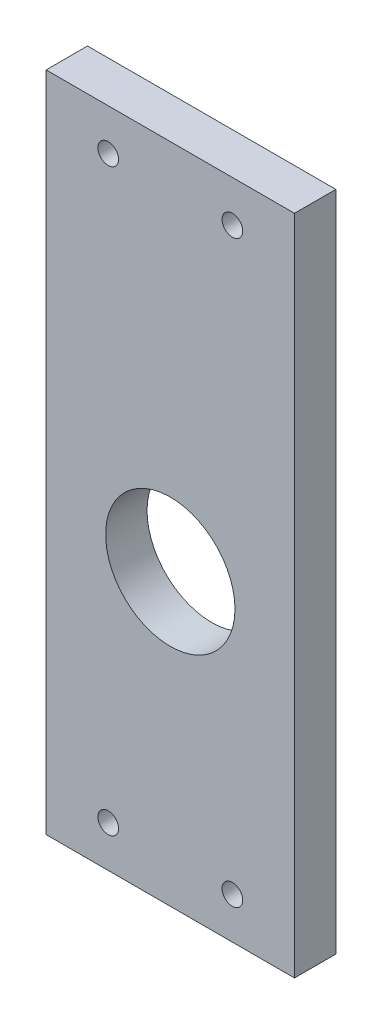
ISO-10303-21;
HEADER;
FILE_DESCRIPTION(('STEP AP214'),'2;1');
FILE_NAME('part.step','',(''),(''),'','','');
FILE_SCHEMA(('AUTOMOTIVE_DESIGN { 1 0 10303 214 1 1 1 1 }'));
ENDSEC;
DATA;
#1=APPLICATION_CONTEXT('core data for automotive mechanical design processes');
#2=APPLICATION_PROTOCOL_DEFINITION('international standard','automotive_design',2000,#1);
#3=PRODUCT_CONTEXT('',#1,'mechanical');
#4=PRODUCT('Part','Part','',(#3));
#5=PRODUCT_RELATED_PRODUCT_CATEGORY('part','',(#4));
#6=PRODUCT_DEFINITION_FORMATION('','',#4);
#7=PRODUCT_DEFINITION_CONTEXT('part definition',#1,'design');
#8=PRODUCT_DEFINITION('design','',#6,#7);
#9=PRODUCT_DEFINITION_SHAPE('','',#8);
#10=(LENGTH_UNIT() NAMED_UNIT(*) SI_UNIT(.MILLI.,.METRE.));
#11=(NAMED_UNIT(*) PLANE_ANGLE_UNIT() SI_UNIT($,.RADIAN.));
#12=(NAMED_UNIT(*) SI_UNIT($,.STERADIAN.) SOLID_ANGLE_UNIT());
#13=UNCERTAINTY_MEASURE_WITH_UNIT(LENGTH_MEASURE(1.E-05),#10,'distance_accuracy_value','');
#14=(GEOMETRIC_REPRESENTATION_CONTEXT(3) GLOBAL_UNCERTAINTY_ASSIGNED_CONTEXT((#13)) GLOBAL_UNIT_ASSIGNED_CONTEXT((#10,
#11,#12)) REPRESENTATION_CONTEXT('',''));
#15=CARTESIAN_POINT('',(0.,0.,0.));
#16=DIRECTION('',(0.,0.,1.));
#17=DIRECTION('',(1.,0.,0.));
#18=AXIS2_PLACEMENT_3D('',#15,#16,#17);
#19=CARTESIAN_POINT('',(0.,0.,12.7));
#20=DIRECTION('',(1.,0.,0.));
#21=DIRECTION('',(0.,0.,-1.));
#22=AXIS2_PLACEMENT_3D('',#19,#20,#21);
#23=PLANE('',#22);
#24=DIRECTION('',(0.,-1.,0.));
#25=VECTOR('',#24,1.);
#26=CARTESIAN_POINT('',(0.,0.,0.));
#27=LINE('',#26,#25);
#28=CARTESIAN_POINT('',(0.,203.2,0.));
#29=VERTEX_POINT('',#28);
#30=CARTESIAN_POINT('',(0.,0.,0.));
#31=VERTEX_POINT('',#30);
#32=EDGE_CURVE('E95',#29,#31,#27,.T.);
#33=ORIENTED_EDGE('',*,*,#32,.T.);
#34=DIRECTION('',(0.,0.,-1.));
#35=VECTOR('',#34,1.);
#36=CARTESIAN_POINT('',(0.,0.,12.7));
#37=LINE('',#36,#35);
#38=CARTESIAN_POINT('',(0.,0.,12.7));
#39=VERTEX_POINT('',#38);
#40=EDGE_CURVE('E11',#39,#31,#37,.T.);
#41=ORIENTED_EDGE('',*,*,#40,.F.);
#42=DIRECTION('',(0.,-1.,0.));
#43=VECTOR('',#42,1.);
#44=CARTESIAN_POINT('',(0.,0.,12.7));
#45=LINE('',#44,#43);
#46=CARTESIAN_POINT('',(0.,203.2,12.7));
#47=VERTEX_POINT('',#46);
#48=EDGE_CURVE('E83',#47,#39,#45,.T.);
#49=ORIENTED_EDGE('',*,*,#48,.F.);
#50=DIRECTION('',(0.,0.,-1.));
#51=VECTOR('',#50,1.);
#52=CARTESIAN_POINT('',(0.,203.2,12.7));
#53=LINE('',#52,#51);
#54=EDGE_CURVE('E91',#47,#29,#53,.T.);
#55=ORIENTED_EDGE('',*,*,#54,.T.);
#56=EDGE_LOOP('',(#33,#41,#49,#55));
#57=FACE_BOUND('',#56,.T.);
#58=ADVANCED_FACE('F32',(#57),#23,.F.);
#59=CARTESIAN_POINT('',(0.,0.,12.7));
#60=DIRECTION('',(0.,1.,0.));
#61=DIRECTION('',(0.,0.,1.));
#62=AXIS2_PLACEMENT_3D('',#59,#60,#61);
#63=PLANE('',#62);
#64=DIRECTION('',(1.,0.,0.));
#65=VECTOR('',#64,1.);
#66=CARTESIAN_POINT('',(0.,0.,0.));
#67=LINE('',#66,#65);
#68=CARTESIAN_POINT('',(76.2,0.,0.));
#69=VERTEX_POINT('',#68);
#70=EDGE_CURVE('E87',#31,#69,#67,.T.);
#71=ORIENTED_EDGE('',*,*,#70,.T.);
#72=DIRECTION('',(0.,0.,-1.));
#73=VECTOR('',#72,1.);
#74=CARTESIAN_POINT('',(76.2,0.,12.7));
#75=LINE('',#74,#73);
#76=CARTESIAN_POINT('',(76.2,0.,12.7));
#77=VERTEX_POINT('',#76);
#78=EDGE_CURVE('E40',#77,#69,#75,.T.);
#79=ORIENTED_EDGE('',*,*,#78,.F.);
#80=DIRECTION('',(1.,0.,0.));
#81=VECTOR('',#80,1.);
#82=CARTESIAN_POINT('',(0.,0.,12.7));
#83=LINE('',#82,#81);
#84=EDGE_CURVE('E78',#39,#77,#83,.T.);
#85=ORIENTED_EDGE('',*,*,#84,.F.);
#86=ORIENTED_EDGE('',*,*,#40,.T.);
#87=EDGE_LOOP('',(#71,#79,#85,#86));
#88=FACE_BOUND('',#87,.T.);
#89=ADVANCED_FACE('F86',(#88),#63,.F.);
#90=CARTESIAN_POINT('',(76.2,0.,12.7));
#91=DIRECTION('',(-1.,0.,0.));
#92=DIRECTION('',(0.,0.,1.));
#93=AXIS2_PLACEMENT_3D('',#90,#91,#92);
#94=PLANE('',#93);
#95=DIRECTION('',(0.,1.,0.));
#96=VECTOR('',#95,1.);
#97=CARTESIAN_POINT('',(76.2,0.,0.));
#98=LINE('',#97,#96);
#99=CARTESIAN_POINT('',(76.2,203.2,0.));
#100=VERTEX_POINT('',#99);
#101=EDGE_CURVE('E65',#69,#100,#98,.T.);
#102=ORIENTED_EDGE('',*,*,#101,.T.);
#103=DIRECTION('',(0.,0.,-1.));
#104=VECTOR('',#103,1.);
#105=CARTESIAN_POINT('',(76.2,203.2,12.7));
#106=LINE('',#105,#104);
#107=CARTESIAN_POINT('',(76.2,203.2,12.7));
#108=VERTEX_POINT('',#107);
#109=EDGE_CURVE('E88',#108,#100,#106,.T.);
#110=ORIENTED_EDGE('',*,*,#109,.F.);
#111=DIRECTION('',(0.,1.,0.));
#112=VECTOR('',#111,1.);
#113=CARTESIAN_POINT('',(76.2,0.,12.7));
#114=LINE('',#113,#112);
#115=EDGE_CURVE('E81',#77,#108,#114,.T.);
#116=ORIENTED_EDGE('',*,*,#115,.F.);
#117=ORIENTED_EDGE('',*,*,#78,.T.);
#118=EDGE_LOOP('',(#102,#110,#116,#117));
#119=FACE_BOUND('',#118,.T.);
#120=ADVANCED_FACE('F89',(#119),#94,.F.);
#121=CARTESIAN_POINT('',(0.,203.2,12.7));
#122=DIRECTION('',(0.,-1.,0.));
#123=DIRECTION('',(0.,0.,-1.));
#124=AXIS2_PLACEMENT_3D('',#121,#122,#123);
#125=PLANE('',#124);
#126=DIRECTION('',(-1.,0.,0.));
#127=VECTOR('',#126,1.);
#128=CARTESIAN_POINT('',(0.,203.2,0.));
#129=LINE('',#128,#127);
#130=EDGE_CURVE('E71',#100,#29,#129,.T.);
#131=ORIENTED_EDGE('',*,*,#130,.T.);
#132=ORIENTED_EDGE('',*,*,#54,.F.);
#133=DIRECTION('',(-1.,0.,0.));
#134=VECTOR('',#133,1.);
#135=CARTESIAN_POINT('',(0.,203.2,12.7));
#136=LINE('',#135,#134);
#137=EDGE_CURVE('E48',#108,#47,#136,.T.);
#138=ORIENTED_EDGE('',*,*,#137,.F.);
#139=ORIENTED_EDGE('',*,*,#109,.T.);
#140=EDGE_LOOP('',(#131,#132,#138,#139));
#141=FACE_BOUND('',#140,.T.);
#142=ADVANCED_FACE('F103',(#141),#125,.F.);
#143=CARTESIAN_POINT('',(0.,0.,12.7));
#144=DIRECTION('',(0.,0.,-1.));
#145=DIRECTION('',(-1.,0.,0.));
#146=AXIS2_PLACEMENT_3D('',#143,#144,#145);
#147=PLANE('',#146);
#148=CARTESIAN_POINT('',(57.15,190.5,12.7));
#149=DIRECTION('',(0.,0.,1.));
#150=DIRECTION('',(1.,0.,0.));
#151=AXIS2_PLACEMENT_3D('',#148,#149,#150);
#152=CIRCLE('',#151,3.175);
#153=CARTESIAN_POINT('',(60.325,190.5,12.7));
#154=VERTEX_POINT('',#153);
#155=EDGE_CURVE('E124',#154,#154,#152,.T.);
#156=ORIENTED_EDGE('',*,*,#155,.F.);
#157=EDGE_LOOP('',(#156));
#158=FACE_BOUND('',#157,.T.);
#159=CARTESIAN_POINT('',(19.05,12.7,12.7));
#160=DIRECTION('',(0.,0.,1.));
#161=DIRECTION('',(1.,0.,0.));
#162=AXIS2_PLACEMENT_3D('',#159,#160,#161);
#163=CIRCLE('',#162,3.175);
#164=CARTESIAN_POINT('',(22.225,12.7,12.7));
#165=VERTEX_POINT('',#164);
#166=EDGE_CURVE('E125',#165,#165,#163,.T.);
#167=ORIENTED_EDGE('',*,*,#166,.F.);
#168=EDGE_LOOP('',(#167));
#169=FACE_BOUND('',#168,.T.);
#170=CARTESIAN_POINT('',(57.15,12.7,12.7));
#171=DIRECTION('',(0.,0.,1.));
#172=DIRECTION('',(1.,0.,0.));
#173=AXIS2_PLACEMENT_3D('',#170,#171,#172);
#174=CIRCLE('',#173,3.175);
#175=CARTESIAN_POINT('',(60.325,12.7,12.7));
#176=VERTEX_POINT('',#175);
#177=EDGE_CURVE('E135',#176,#176,#174,.T.);
#178=ORIENTED_EDGE('',*,*,#177,.F.);
#179=EDGE_LOOP('',(#178));
#180=FACE_BOUND('',#179,.T.);
#181=CARTESIAN_POINT('',(19.05,190.5,12.7));
#182=DIRECTION('',(0.,0.,1.));
#183=DIRECTION('',(1.,0.,0.));
#184=AXIS2_PLACEMENT_3D('',#181,#182,#183);
#185=CIRCLE('',#184,3.175);
#186=CARTESIAN_POINT('',(22.225,190.5,12.7));
#187=VERTEX_POINT('',#186);
#188=EDGE_CURVE('E117',#187,#187,#185,.T.);
#189=ORIENTED_EDGE('',*,*,#188,.F.);
#190=EDGE_LOOP('',(#189));
#191=FACE_BOUND('',#190,.T.);
#192=CARTESIAN_POINT('',(38.1,88.9,12.7));
#193=DIRECTION('',(0.,0.,1.));
#194=DIRECTION('',(1.,0.,0.));
#195=AXIS2_PLACEMENT_3D('',#192,#193,#194);
#196=CIRCLE('',#195,19.84375);
#197=CARTESIAN_POINT('',(57.94375,88.9,12.7));
#198=VERTEX_POINT('',#197);
#199=EDGE_CURVE('E111',#198,#198,#196,.T.);
#200=ORIENTED_EDGE('',*,*,#199,.F.);
#201=EDGE_LOOP('',(#200));
#202=FACE_BOUND('',#201,.T.);
#203=ORIENTED_EDGE('',*,*,#48,.T.);
#204=ORIENTED_EDGE('',*,*,#84,.T.);
#205=ORIENTED_EDGE('',*,*,#115,.T.);
#206=ORIENTED_EDGE('',*,*,#137,.T.);
#207=EDGE_LOOP('',(#203,#204,#205,#206));
#208=FACE_BOUND('',#207,.T.);
#209=ADVANCED_FACE('F79',(#158,#169,#180,#191,#202,#208),#147,.F.);
#210=CARTESIAN_POINT('',(0.,0.,0.));
#211=DIRECTION('',(0.,0.,-1.));
#212=DIRECTION('',(-1.,0.,0.));
#213=AXIS2_PLACEMENT_3D('',#210,#211,#212);
#214=PLANE('',#213);
#215=CARTESIAN_POINT('',(57.15,190.5,0.));
#216=DIRECTION('',(0.,0.,-1.));
#217=DIRECTION('',(-1.,0.,0.));
#218=AXIS2_PLACEMENT_3D('',#215,#216,#217);
#219=CIRCLE('',#218,3.175);
#220=CARTESIAN_POINT('',(53.975,190.5,0.));
#221=VERTEX_POINT('',#220);
#222=EDGE_CURVE('E120',#221,#221,#219,.F.);
#223=ORIENTED_EDGE('',*,*,#222,.T.);
#224=EDGE_LOOP('',(#223));
#225=FACE_BOUND('',#224,.T.);
#226=CARTESIAN_POINT('',(19.05,12.7,0.));
#227=DIRECTION('',(0.,0.,-1.));
#228=DIRECTION('',(-1.,0.,0.));
#229=AXIS2_PLACEMENT_3D('',#226,#227,#228);
#230=CIRCLE('',#229,3.175);
#231=CARTESIAN_POINT('',(15.875,12.7,0.));
#232=VERTEX_POINT('',#231);
#233=EDGE_CURVE('E121',#232,#232,#230,.F.);
#234=ORIENTED_EDGE('',*,*,#233,.T.);
#235=EDGE_LOOP('',(#234));
#236=FACE_BOUND('',#235,.T.);
#237=CARTESIAN_POINT('',(57.15,12.7,0.));
#238=DIRECTION('',(0.,0.,-1.));
#239=DIRECTION('',(-1.,0.,0.));
#240=AXIS2_PLACEMENT_3D('',#237,#238,#239);
#241=CIRCLE('',#240,3.175);
#242=CARTESIAN_POINT('',(53.975,12.7,0.));
#243=VERTEX_POINT('',#242);
#244=EDGE_CURVE('E128',#243,#243,#241,.F.);
#245=ORIENTED_EDGE('',*,*,#244,.T.);
#246=EDGE_LOOP('',(#245));
#247=FACE_BOUND('',#246,.T.);
#248=CARTESIAN_POINT('',(19.05,190.5,0.));
#249=DIRECTION('',(0.,0.,-1.));
#250=DIRECTION('',(-1.,0.,0.));
#251=AXIS2_PLACEMENT_3D('',#248,#249,#250);
#252=CIRCLE('',#251,3.175);
#253=CARTESIAN_POINT('',(15.875,190.5,0.));
#254=VERTEX_POINT('',#253);
#255=EDGE_CURVE('E114',#254,#254,#252,.F.);
#256=ORIENTED_EDGE('',*,*,#255,.T.);
#257=EDGE_LOOP('',(#256));
#258=FACE_BOUND('',#257,.T.);
#259=CARTESIAN_POINT('',(38.1,88.9,0.));
#260=DIRECTION('',(0.,0.,-1.));
#261=DIRECTION('',(-1.,0.,0.));
#262=AXIS2_PLACEMENT_3D('',#259,#260,#261);
#263=CIRCLE('',#262,19.84375);
#264=CARTESIAN_POINT('',(18.25625,88.9,0.));
#265=VERTEX_POINT('',#264);
#266=EDGE_CURVE('E98',#265,#265,#263,.F.);
#267=ORIENTED_EDGE('',*,*,#266,.T.);
#268=EDGE_LOOP('',(#267));
#269=FACE_BOUND('',#268,.T.);
#270=ORIENTED_EDGE('',*,*,#32,.F.);
#271=ORIENTED_EDGE('',*,*,#130,.F.);
#272=ORIENTED_EDGE('',*,*,#101,.F.);
#273=ORIENTED_EDGE('',*,*,#70,.F.);
#274=EDGE_LOOP('',(#270,#271,#272,#273));
#275=FACE_BOUND('',#274,.T.);
#276=ADVANCED_FACE('F106',(#225,#236,#247,#258,#269,#275),#214,.T.);
#277=CARTESIAN_POINT('',(38.1,88.9,-56.1266007566822));
#278=DIRECTION('',(0.,0.,1.));
#279=DIRECTION('',(1.,0.,0.));
#280=AXIS2_PLACEMENT_3D('',#277,#278,#279);
#281=CYLINDRICAL_SURFACE('',#280,19.84375);
#282=ORIENTED_EDGE('',*,*,#199,.T.);
#283=EDGE_LOOP('',(#282));
#284=FACE_BOUND('',#283,.T.);
#285=ORIENTED_EDGE('',*,*,#266,.F.);
#286=EDGE_LOOP('',(#285));
#287=FACE_BOUND('',#286,.T.);
#288=ADVANCED_FACE('F150',(#284,#287),#281,.F.);
#289=CARTESIAN_POINT('',(19.05,190.5,-8.98025612106917));
#290=DIRECTION('',(0.,0.,1.));
#291=DIRECTION('',(1.,0.,0.));
#292=AXIS2_PLACEMENT_3D('',#289,#290,#291);
#293=CYLINDRICAL_SURFACE('',#292,3.175);
#294=ORIENTED_EDGE('',*,*,#188,.T.);
#295=EDGE_LOOP('',(#294));
#296=FACE_BOUND('',#295,.T.);
#297=ORIENTED_EDGE('',*,*,#255,.F.);
#298=EDGE_LOOP('',(#297));
#299=FACE_BOUND('',#298,.T.);
#300=ADVANCED_FACE('F153',(#296,#299),#293,.F.);
#301=CARTESIAN_POINT('',(57.15,12.7,-8.98025612106917));
#302=DIRECTION('',(0.,0.,1.));
#303=DIRECTION('',(1.,0.,0.));
#304=AXIS2_PLACEMENT_3D('',#301,#302,#303);
#305=CYLINDRICAL_SURFACE('',#304,3.175);
#306=ORIENTED_EDGE('',*,*,#177,.T.);
#307=EDGE_LOOP('',(#306));
#308=FACE_BOUND('',#307,.T.);
#309=ORIENTED_EDGE('',*,*,#244,.F.);
#310=EDGE_LOOP('',(#309));
#311=FACE_BOUND('',#310,.T.);
#312=ADVANCED_FACE('F139',(#308,#311),#305,.F.);
#313=CARTESIAN_POINT('',(19.05,12.7,-8.98025612106917));
#314=DIRECTION('',(0.,0.,1.));
#315=DIRECTION('',(1.,0.,0.));
#316=AXIS2_PLACEMENT_3D('',#313,#314,#315);
#317=CYLINDRICAL_SURFACE('',#316,3.175);
#318=ORIENTED_EDGE('',*,*,#166,.T.);
#319=EDGE_LOOP('',(#318));
#320=FACE_BOUND('',#319,.T.);
#321=ORIENTED_EDGE('',*,*,#233,.F.);
#322=EDGE_LOOP('',(#321));
#323=FACE_BOUND('',#322,.T.);
#324=ADVANCED_FACE('F206',(#320,#323),#317,.F.);
#325=CARTESIAN_POINT('',(57.15,190.5,-8.98025612106917));
#326=DIRECTION('',(0.,0.,1.));
#327=DIRECTION('',(1.,0.,0.));
#328=AXIS2_PLACEMENT_3D('',#325,#326,#327);
#329=CYLINDRICAL_SURFACE('',#328,3.175);
#330=ORIENTED_EDGE('',*,*,#155,.T.);
#331=EDGE_LOOP('',(#330));
#332=FACE_BOUND('',#331,.T.);
#333=ORIENTED_EDGE('',*,*,#222,.F.);
#334=EDGE_LOOP('',(#333));
#335=FACE_BOUND('',#334,.T.);
#336=ADVANCED_FACE('F215',(#332,#335),#329,.F.);
#337=CLOSED_SHELL('',(#58,#89,#120,#142,#209,#276,#288,#300,#312,#324,#336));
#338=MANIFOLD_SOLID_BREP('B2',#337);
#339=ADVANCED_BREP_SHAPE_REPRESENTATION('',(#18,#338),#14);
#340=SHAPE_DEFINITION_REPRESENTATION(#9,#339);
ENDSEC;
END-ISO-10303-21;
